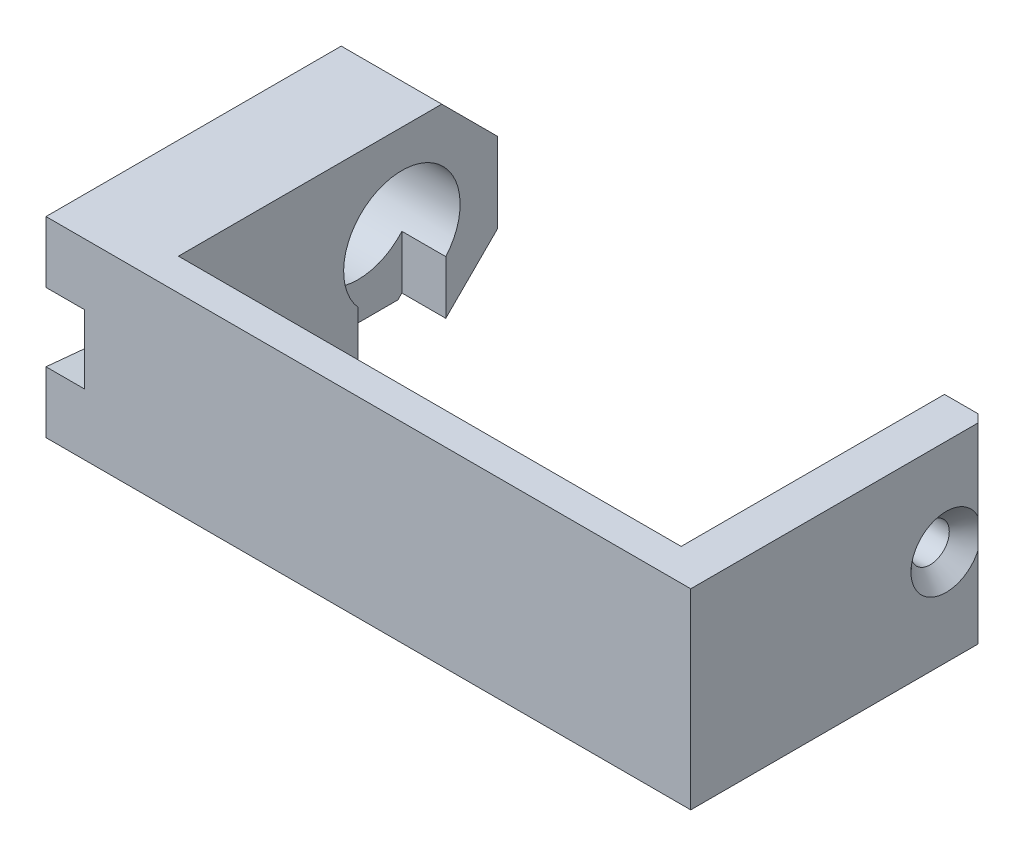
ISO-10303-21;
HEADER;
FILE_DESCRIPTION(('STEP AP214'),'2;1');
FILE_NAME('part.step','',(''),(''),'','','');
FILE_SCHEMA(('AUTOMOTIVE_DESIGN { 1 0 10303 214 1 1 1 1 }'));
ENDSEC;
DATA;
#1=APPLICATION_CONTEXT('core data for automotive mechanical design processes');
#2=APPLICATION_PROTOCOL_DEFINITION('international standard','automotive_design',2000,#1);
#3=PRODUCT_CONTEXT('',#1,'mechanical');
#4=PRODUCT('Part','Part','',(#3));
#5=PRODUCT_RELATED_PRODUCT_CATEGORY('part','',(#4));
#6=PRODUCT_DEFINITION_FORMATION('','',#4);
#7=PRODUCT_DEFINITION_CONTEXT('part definition',#1,'design');
#8=PRODUCT_DEFINITION('design','',#6,#7);
#9=PRODUCT_DEFINITION_SHAPE('','',#8);
#10=(LENGTH_UNIT() NAMED_UNIT(*) SI_UNIT(.MILLI.,.METRE.));
#11=(NAMED_UNIT(*) PLANE_ANGLE_UNIT() SI_UNIT($,.RADIAN.));
#12=(NAMED_UNIT(*) SI_UNIT($,.STERADIAN.) SOLID_ANGLE_UNIT());
#13=UNCERTAINTY_MEASURE_WITH_UNIT(LENGTH_MEASURE(1.E-05),#10,'distance_accuracy_value','');
#14=(GEOMETRIC_REPRESENTATION_CONTEXT(3) GLOBAL_UNCERTAINTY_ASSIGNED_CONTEXT((#13)) GLOBAL_UNIT_ASSIGNED_CONTEXT((#10,
#11,#12)) REPRESENTATION_CONTEXT('',''));
#15=CARTESIAN_POINT('',(0.,0.,0.));
#16=DIRECTION('',(0.,0.,1.));
#17=DIRECTION('',(1.,0.,0.));
#18=AXIS2_PLACEMENT_3D('',#15,#16,#17);
#19=CARTESIAN_POINT('',(20.2,-6.,22.));
#20=DIRECTION('',(0.,-1.,0.));
#21=DIRECTION('',(1.,0.,0.));
#22=AXIS2_PLACEMENT_3D('',#19,#20,#21);
#23=PLANE('',#22);
#24=DIRECTION('',(0.,0.,1.));
#25=VECTOR('',#24,1.);
#26=CARTESIAN_POINT('',(-16.65,-6.,22.));
#27=LINE('',#26,#25);
#28=CARTESIAN_POINT('',(-16.65,-6.,3.50000000000002));
#29=VERTEX_POINT('',#28);
#30=CARTESIAN_POINT('',(-16.65,-6.,8.75));
#31=VERTEX_POINT('',#30);
#32=EDGE_CURVE('E187',#29,#31,#27,.T.);
#33=ORIENTED_EDGE('',*,*,#32,.T.);
#34=DIRECTION('',(1.,0.,0.));
#35=VECTOR('',#34,1.);
#36=CARTESIAN_POINT('',(20.2,-6.,8.75));
#37=LINE('',#36,#35);
#38=CARTESIAN_POINT('',(-13.9,-6.,8.75));
#39=VERTEX_POINT('',#38);
#40=EDGE_CURVE('E209',#31,#39,#37,.T.);
#41=ORIENTED_EDGE('',*,*,#40,.T.);
#42=DIRECTION('',(0.,0.,1.));
#43=VECTOR('',#42,1.);
#44=CARTESIAN_POINT('',(-13.9,-6.,0.));
#45=LINE('',#44,#43);
#46=CARTESIAN_POINT('',(-13.9,-6.,20.));
#47=VERTEX_POINT('',#46);
#48=EDGE_CURVE('E246',#39,#47,#45,.T.);
#49=ORIENTED_EDGE('',*,*,#48,.T.);
#50=DIRECTION('',(1.,0.,0.));
#51=VECTOR('',#50,1.);
#52=CARTESIAN_POINT('',(-13.9,-6.,20.));
#53=LINE('',#52,#51);
#54=CARTESIAN_POINT('',(17.6,-6.,20.));
#55=VERTEX_POINT('',#54);
#56=EDGE_CURVE('E260',#47,#55,#53,.T.);
#57=ORIENTED_EDGE('',*,*,#56,.T.);
#58=DIRECTION('',(0.,0.,-1.));
#59=VECTOR('',#58,1.);
#60=CARTESIAN_POINT('',(17.6,-6.,0.));
#61=LINE('',#60,#59);
#62=CARTESIAN_POINT('',(17.6,-6.,3.50000000000002));
#63=VERTEX_POINT('',#62);
#64=EDGE_CURVE('E243',#55,#63,#61,.T.);
#65=ORIENTED_EDGE('',*,*,#64,.T.);
#66=DIRECTION('',(1.,0.,0.));
#67=VECTOR('',#66,1.);
#68=CARTESIAN_POINT('',(20.2,-6.,3.50000000000002));
#69=LINE('',#68,#67);
#70=CARTESIAN_POINT('',(19.6999999999999,-6.,3.50000000000002));
#71=VERTEX_POINT('',#70);
#72=EDGE_CURVE('E302',#63,#71,#69,.T.);
#73=ORIENTED_EDGE('',*,*,#72,.T.);
#74=DIRECTION('',(-0.707106781186544,0.,-0.707106781186551));
#75=VECTOR('',#74,1.);
#76=CARTESIAN_POINT('',(29.2,-6.,13.0000000000001));
#77=LINE('',#76,#75);
#78=CARTESIAN_POINT('',(20.2,-6.,4.00000000000007));
#79=VERTEX_POINT('',#78);
#80=EDGE_CURVE('E431',#71,#79,#77,.F.);
#81=ORIENTED_EDGE('',*,*,#80,.T.);
#82=DIRECTION('',(0.,0.,-1.));
#83=VECTOR('',#82,1.);
#84=CARTESIAN_POINT('',(20.2,-6.,22.));
#85=LINE('',#84,#83);
#86=CARTESIAN_POINT('',(20.2,-6.,22.));
#87=VERTEX_POINT('',#86);
#88=EDGE_CURVE('E281',#87,#79,#85,.T.);
#89=ORIENTED_EDGE('',*,*,#88,.F.);
#90=DIRECTION('',(-1.,0.,0.));
#91=VECTOR('',#90,1.);
#92=CARTESIAN_POINT('',(20.2,-6.,22.));
#93=LINE('',#92,#91);
#94=CARTESIAN_POINT('',(-20.2,-6.,22.));
#95=VERTEX_POINT('',#94);
#96=EDGE_CURVE('E278',#87,#95,#93,.T.);
#97=ORIENTED_EDGE('',*,*,#96,.T.);
#98=DIRECTION('',(0.,0.,-1.));
#99=VECTOR('',#98,1.);
#100=CARTESIAN_POINT('',(-20.2,-6.,22.));
#101=LINE('',#100,#99);
#102=CARTESIAN_POINT('',(-20.2,-6.,3.50000000000002));
#103=VERTEX_POINT('',#102);
#104=EDGE_CURVE('E286',#95,#103,#101,.T.);
#105=ORIENTED_EDGE('',*,*,#104,.T.);
#106=DIRECTION('',(1.,0.,0.));
#107=VECTOR('',#106,1.);
#108=CARTESIAN_POINT('',(-13.9,-6.,3.50000000000002));
#109=LINE('',#108,#107);
#110=EDGE_CURVE('E300',#103,#29,#109,.T.);
#111=ORIENTED_EDGE('',*,*,#110,.T.);
#112=EDGE_LOOP('',(#33,#41,#49,#57,#65,#73,#81,#89,#97,#105,#111));
#113=FACE_BOUND('',#112,.T.);
#114=ADVANCED_FACE('F37',(#113),#23,.T.);
#115=CARTESIAN_POINT('',(-13.9,-6.00100000000001,0.));
#116=DIRECTION('',(-1.,0.,0.));
#117=DIRECTION('',(0.,0.,1.));
#118=AXIS2_PLACEMENT_3D('',#115,#116,#117);
#119=PLANE('',#118);
#120=DIRECTION('',(0.,-1.,0.));
#121=VECTOR('',#120,1.);
#122=CARTESIAN_POINT('',(-13.9,-6.00100000000001,8.75));
#123=LINE('',#122,#121);
#124=CARTESIAN_POINT('',(-13.9,-2.4,8.75));
#125=VERTEX_POINT('',#124);
#126=EDGE_CURVE('E207',#125,#39,#123,.T.);
#127=ORIENTED_EDGE('',*,*,#126,.F.);
#128=CARTESIAN_POINT('',(-13.9,0.,6.));
#129=DIRECTION('',(-1.,0.,0.));
#130=DIRECTION('',(0.,0.,1.));
#131=AXIS2_PLACEMENT_3D('',#128,#129,#130);
#132=CIRCLE('',#131,3.65);
#133=CARTESIAN_POINT('',(-13.9,-2.4,3.25));
#134=VERTEX_POINT('',#133);
#135=EDGE_CURVE('E212',#125,#134,#132,.T.);
#136=ORIENTED_EDGE('',*,*,#135,.T.);
#137=DIRECTION('',(0.,1.,0.));
#138=VECTOR('',#137,1.);
#139=CARTESIAN_POINT('',(-13.9,-6.00100000000001,3.25));
#140=LINE('',#139,#138);
#141=CARTESIAN_POINT('',(-13.9,-5.74999999999999,3.25));
#142=VERTEX_POINT('',#141);
#143=EDGE_CURVE('E53',#142,#134,#140,.T.);
#144=ORIENTED_EDGE('',*,*,#143,.F.);
#145=DIRECTION('',(0.,0.707106781186546,-0.707106781186549));
#146=VECTOR('',#145,1.);
#147=CARTESIAN_POINT('',(-13.9,-2.5,0.));
#148=LINE('',#147,#146);
#149=CARTESIAN_POINT('',(-13.9,-2.5,0.));
#150=VERTEX_POINT('',#149);
#151=EDGE_CURVE('E201',#142,#150,#148,.T.);
#152=ORIENTED_EDGE('',*,*,#151,.T.);
#153=DIRECTION('',(0.,1.,0.));
#154=VECTOR('',#153,1.);
#155=CARTESIAN_POINT('',(-13.9,-6.00100000000001,0.));
#156=LINE('',#155,#154);
#157=CARTESIAN_POINT('',(-13.9,2.49999999999999,0.));
#158=VERTEX_POINT('',#157);
#159=EDGE_CURVE('E257',#150,#158,#156,.T.);
#160=ORIENTED_EDGE('',*,*,#159,.T.);
#161=DIRECTION('',(0.,-0.707106781186548,-0.707106781186547));
#162=VECTOR('',#161,1.);
#163=CARTESIAN_POINT('',(-13.9,6.,3.50000000000001));
#164=LINE('',#163,#162);
#165=CARTESIAN_POINT('',(-13.9,6.,3.5));
#166=VERTEX_POINT('',#165);
#167=EDGE_CURVE('E319',#158,#166,#164,.F.);
#168=ORIENTED_EDGE('',*,*,#167,.T.);
#169=DIRECTION('',(0.,0.,1.));
#170=VECTOR('',#169,1.);
#171=CARTESIAN_POINT('',(-13.9,6.,0.));
#172=LINE('',#171,#170);
#173=CARTESIAN_POINT('',(-13.9,6.,20.));
#174=VERTEX_POINT('',#173);
#175=EDGE_CURVE('E248',#166,#174,#172,.T.);
#176=ORIENTED_EDGE('',*,*,#175,.T.);
#177=DIRECTION('',(0.,1.,0.));
#178=VECTOR('',#177,1.);
#179=CARTESIAN_POINT('',(-13.9,-6.00100000000001,20.));
#180=LINE('',#179,#178);
#181=EDGE_CURVE('E256',#47,#174,#180,.T.);
#182=ORIENTED_EDGE('',*,*,#181,.F.);
#183=ORIENTED_EDGE('',*,*,#48,.F.);
#184=EDGE_LOOP('',(#127,#136,#144,#152,#160,#168,#176,#182,#183));
#185=FACE_BOUND('',#184,.T.);
#186=ADVANCED_FACE('F361',(#185),#119,.F.);
#187=CARTESIAN_POINT('',(0.,-2.5,0.));
#188=DIRECTION('',(0.,-0.707106781186549,-0.707106781186546));
#189=DIRECTION('',(1.,0.,0.));
#190=AXIS2_PLACEMENT_3D('',#187,#188,#189);
#191=PLANE('',#190);
#192=DIRECTION('',(-1.,0.,0.));
#193=VECTOR('',#192,1.);
#194=CARTESIAN_POINT('',(0.,-5.74999999999999,3.25));
#195=LINE('',#194,#193);
#196=CARTESIAN_POINT('',(-16.65,-5.74999999999998,3.25));
#197=VERTEX_POINT('',#196);
#198=EDGE_CURVE('E192',#142,#197,#195,.T.);
#199=ORIENTED_EDGE('',*,*,#198,.T.);
#200=DIRECTION('',(0.,-0.707106781186546,0.707106781186549));
#201=VECTOR('',#200,1.);
#202=CARTESIAN_POINT('',(-16.65,-2.5,0.));
#203=LINE('',#202,#201);
#204=EDGE_CURVE('E180',#197,#29,#203,.T.);
#205=ORIENTED_EDGE('',*,*,#204,.T.);
#206=ORIENTED_EDGE('',*,*,#110,.F.);
#207=DIRECTION('',(0.,-0.707106781186546,0.707106781186549));
#208=VECTOR('',#207,1.);
#209=CARTESIAN_POINT('',(-20.2,-15.25,12.75));
#210=LINE('',#209,#208);
#211=CARTESIAN_POINT('',(-20.2,-2.5,0.));
#212=VERTEX_POINT('',#211);
#213=EDGE_CURVE('E317',#212,#103,#210,.T.);
#214=ORIENTED_EDGE('',*,*,#213,.F.);
#215=DIRECTION('',(-1.,0.,0.));
#216=VECTOR('',#215,1.);
#217=CARTESIAN_POINT('',(-20.2,-2.5,0.));
#218=LINE('',#217,#216);
#219=EDGE_CURVE('E312',#150,#212,#218,.T.);
#220=ORIENTED_EDGE('',*,*,#219,.F.);
#221=ORIENTED_EDGE('',*,*,#151,.F.);
#222=EDGE_LOOP('',(#199,#205,#206,#214,#220,#221));
#223=FACE_BOUND('',#222,.T.);
#224=ADVANCED_FACE('F199',(#223),#191,.T.);
#225=CARTESIAN_POINT('',(-17.8,0.,6.));
#226=DIRECTION('',(-1.,0.,0.));
#227=DIRECTION('',(0.,0.,1.));
#228=AXIS2_PLACEMENT_3D('',#225,#226,#227);
#229=CYLINDRICAL_SURFACE('',#228,3.65);
#230=CARTESIAN_POINT('',(-20.2,0.,6.));
#231=DIRECTION('',(-1.,0.,0.));
#232=DIRECTION('',(0.,0.,1.));
#233=AXIS2_PLACEMENT_3D('',#230,#231,#232);
#234=CIRCLE('',#233,3.65);
#235=CARTESIAN_POINT('',(-20.2,3.63376091186189,6.34392097264438));
#236=VERTEX_POINT('',#235);
#237=CARTESIAN_POINT('',(-20.2,-3.63376091186189,6.34392097264438));
#238=VERTEX_POINT('',#237);
#239=EDGE_CURVE('E215',#236,#238,#234,.T.);
#240=ORIENTED_EDGE('',*,*,#239,.T.);
#241=DIRECTION('',(-1.,0.,0.));
#242=VECTOR('',#241,1.);
#243=CARTESIAN_POINT('',(-17.8,-3.63376091186189,6.34392097264438));
#244=LINE('',#243,#242);
#245=CARTESIAN_POINT('',(-17.8,-3.63376091186189,6.34392097264438));
#246=VERTEX_POINT('',#245);
#247=EDGE_CURVE('E221',#246,#238,#244,.T.);
#248=ORIENTED_EDGE('',*,*,#247,.F.);
#249=CARTESIAN_POINT('',(-17.8,0.,6.));
#250=DIRECTION('',(-1.,0.,0.));
#251=DIRECTION('',(0.,0.,1.));
#252=AXIS2_PLACEMENT_3D('',#249,#250,#251);
#253=CIRCLE('',#252,3.65);
#254=CARTESIAN_POINT('',(-17.8,3.63376091186189,6.34392097264438));
#255=VERTEX_POINT('',#254);
#256=EDGE_CURVE('E417',#246,#255,#253,.T.);
#257=ORIENTED_EDGE('',*,*,#256,.T.);
#258=DIRECTION('',(-1.,0.,0.));
#259=VECTOR('',#258,1.);
#260=CARTESIAN_POINT('',(-17.8,3.63376091186189,6.34392097264438));
#261=LINE('',#260,#259);
#262=EDGE_CURVE('E227',#255,#236,#261,.T.);
#263=ORIENTED_EDGE('',*,*,#262,.T.);
#264=EDGE_LOOP('',(#240,#248,#257,#263));
#265=FACE_BOUND('',#264,.T.);
#266=DIRECTION('',(-1.,0.,0.));
#267=VECTOR('',#266,1.);
#268=CARTESIAN_POINT('',(-17.8,-2.4,8.75));
#269=LINE('',#268,#267);
#270=CARTESIAN_POINT('',(-16.65,-2.4,8.75));
#271=VERTEX_POINT('',#270);
#272=EDGE_CURVE('E11',#271,#125,#269,.F.);
#273=ORIENTED_EDGE('',*,*,#272,.F.);
#274=CARTESIAN_POINT('',(-16.65,0.,6.));
#275=DIRECTION('',(1.,0.,0.));
#276=DIRECTION('',(0.,1.,0.));
#277=AXIS2_PLACEMENT_3D('',#274,#275,#276);
#278=CIRCLE('',#277,3.65);
#279=CARTESIAN_POINT('',(-16.65,-2.4,3.25));
#280=VERTEX_POINT('',#279);
#281=EDGE_CURVE('E46',#280,#271,#278,.F.);
#282=ORIENTED_EDGE('',*,*,#281,.F.);
#283=DIRECTION('',(-1.,0.,0.));
#284=VECTOR('',#283,1.);
#285=CARTESIAN_POINT('',(-17.8,-2.4,3.25));
#286=LINE('',#285,#284);
#287=EDGE_CURVE('E195',#134,#280,#286,.T.);
#288=ORIENTED_EDGE('',*,*,#287,.F.);
#289=ORIENTED_EDGE('',*,*,#135,.F.);
#290=EDGE_LOOP('',(#273,#282,#288,#289));
#291=FACE_BOUND('',#290,.T.);
#292=ADVANCED_FACE('F353',(#265,#291),#229,.F.);
#293=CARTESIAN_POINT('',(17.6,-6.001,0.));
#294=DIRECTION('',(1.,0.,0.));
#295=DIRECTION('',(0.,0.,-1.));
#296=AXIS2_PLACEMENT_3D('',#293,#294,#295);
#297=PLANE('',#296);
#298=DIRECTION('',(0.,0.707106781186549,0.707106781186546));
#299=VECTOR('',#298,1.);
#300=CARTESIAN_POINT('',(17.6,6.,3.5));
#301=LINE('',#300,#299);
#302=CARTESIAN_POINT('',(17.6,6.,3.5));
#303=VERTEX_POINT('',#302);
#304=CARTESIAN_POINT('',(17.6,3.90000000000003,1.40000000000004));
#305=VERTEX_POINT('',#304);
#306=EDGE_CURVE('E295',#303,#305,#301,.F.);
#307=ORIENTED_EDGE('',*,*,#306,.T.);
#308=DIRECTION('',(0.,1.,0.));
#309=VECTOR('',#308,1.);
#310=CARTESIAN_POINT('',(17.6,-6.,1.40000000000004));
#311=LINE('',#310,#309);
#312=CARTESIAN_POINT('',(17.6,-3.90000000000003,1.40000000000004));
#313=VERTEX_POINT('',#312);
#314=EDGE_CURVE('E435',#305,#313,#311,.F.);
#315=ORIENTED_EDGE('',*,*,#314,.T.);
#316=DIRECTION('',(0.,-0.707106781186546,0.707106781186549));
#317=VECTOR('',#316,1.);
#318=CARTESIAN_POINT('',(17.6,-2.49999999999999,0.));
#319=LINE('',#318,#317);
#320=EDGE_CURVE('E298',#313,#63,#319,.T.);
#321=ORIENTED_EDGE('',*,*,#320,.T.);
#322=ORIENTED_EDGE('',*,*,#64,.F.);
#323=DIRECTION('',(0.,1.,0.));
#324=VECTOR('',#323,1.);
#325=CARTESIAN_POINT('',(17.6,-6.001,20.));
#326=LINE('',#325,#324);
#327=CARTESIAN_POINT('',(17.6,6.,20.));
#328=VERTEX_POINT('',#327);
#329=EDGE_CURVE('E261',#55,#328,#326,.T.);
#330=ORIENTED_EDGE('',*,*,#329,.T.);
#331=DIRECTION('',(0.,0.,-1.));
#332=VECTOR('',#331,1.);
#333=CARTESIAN_POINT('',(17.6,6.,0.));
#334=LINE('',#333,#332);
#335=EDGE_CURVE('E253',#328,#303,#334,.T.);
#336=ORIENTED_EDGE('',*,*,#335,.T.);
#337=EDGE_LOOP('',(#307,#315,#321,#322,#330,#336));
#338=FACE_BOUND('',#337,.T.);
#339=CARTESIAN_POINT('',(17.6,0.,6.));
#340=DIRECTION('',(1.,0.,0.));
#341=DIRECTION('',(0.,0.,-1.));
#342=AXIS2_PLACEMENT_3D('',#339,#340,#341);
#343=CIRCLE('',#342,2.5);
#344=CARTESIAN_POINT('',(17.6,0.,3.5));
#345=VERTEX_POINT('',#344);
#346=EDGE_CURVE('E428',#345,#345,#343,.F.);
#347=ORIENTED_EDGE('',*,*,#346,.F.);
#348=EDGE_LOOP('',(#347));
#349=FACE_BOUND('',#348,.T.);
#350=ADVANCED_FACE('F349',(#338,#349),#297,.F.);
#351=CARTESIAN_POINT('',(0.,0.,0.));
#352=DIRECTION('',(0.,0.,1.));
#353=DIRECTION('',(1.,0.,0.));
#354=AXIS2_PLACEMENT_3D('',#351,#352,#353);
#355=PLANE('',#354);
#356=ORIENTED_EDGE('',*,*,#159,.F.);
#357=ORIENTED_EDGE('',*,*,#219,.T.);
#358=DIRECTION('',(0.,1.,0.));
#359=VECTOR('',#358,1.);
#360=CARTESIAN_POINT('',(-20.2,-6.,0.));
#361=LINE('',#360,#359);
#362=CARTESIAN_POINT('',(-20.2,2.49999999999999,0.));
#363=VERTEX_POINT('',#362);
#364=EDGE_CURVE('E267',#212,#363,#361,.T.);
#365=ORIENTED_EDGE('',*,*,#364,.T.);
#366=DIRECTION('',(1.,0.,0.));
#367=VECTOR('',#366,1.);
#368=CARTESIAN_POINT('',(0.,2.49999999999999,0.));
#369=LINE('',#368,#367);
#370=EDGE_CURVE('E310',#363,#158,#369,.T.);
#371=ORIENTED_EDGE('',*,*,#370,.T.);
#372=EDGE_LOOP('',(#356,#357,#365,#371));
#373=FACE_BOUND('',#372,.T.);
#374=ADVANCED_FACE('F352',(#373),#355,.F.);
#375=CARTESIAN_POINT('',(20.2,-6.,22.));
#376=DIRECTION('',(-1.,0.,0.));
#377=DIRECTION('',(0.,0.,1.));
#378=AXIS2_PLACEMENT_3D('',#375,#376,#377);
#379=PLANE('',#378);
#380=ORIENTED_EDGE('',*,*,#88,.T.);
#381=DIRECTION('',(0.,1.,0.));
#382=VECTOR('',#381,1.);
#383=CARTESIAN_POINT('',(20.2,-6.,4.00000000000007));
#384=LINE('',#383,#382);
#385=CARTESIAN_POINT('',(20.2,-0.916515138991321,4.00000000000007));
#386=VERTEX_POINT('',#385);
#387=EDGE_CURVE('E324',#79,#386,#384,.T.);
#388=ORIENTED_EDGE('',*,*,#387,.T.);
#389=CARTESIAN_POINT('',(20.2,0.,6.));
#390=DIRECTION('',(1.,0.,0.));
#391=DIRECTION('',(0.,0.,-1.));
#392=AXIS2_PLACEMENT_3D('',#389,#390,#391);
#393=CIRCLE('',#392,2.2);
#394=CARTESIAN_POINT('',(20.2,0.916515138991321,4.00000000000007));
#395=VERTEX_POINT('',#394);
#396=EDGE_CURVE('E237',#395,#386,#393,.T.);
#397=ORIENTED_EDGE('',*,*,#396,.F.);
#398=DIRECTION('',(0.,1.,0.));
#399=VECTOR('',#398,1.);
#400=CARTESIAN_POINT('',(20.2,-6.,4.00000000000007));
#401=LINE('',#400,#399);
#402=CARTESIAN_POINT('',(20.2,6.,4.00000000000007));
#403=VERTEX_POINT('',#402);
#404=EDGE_CURVE('E322',#395,#403,#401,.T.);
#405=ORIENTED_EDGE('',*,*,#404,.T.);
#406=DIRECTION('',(0.,0.,-1.));
#407=VECTOR('',#406,1.);
#408=CARTESIAN_POINT('',(20.2,6.,22.));
#409=LINE('',#408,#407);
#410=CARTESIAN_POINT('',(20.2,6.,22.));
#411=VERTEX_POINT('',#410);
#412=EDGE_CURVE('E292',#411,#403,#409,.T.);
#413=ORIENTED_EDGE('',*,*,#412,.F.);
#414=DIRECTION('',(0.,1.,0.));
#415=VECTOR('',#414,1.);
#416=CARTESIAN_POINT('',(20.2,-6.,22.));
#417=LINE('',#416,#415);
#418=EDGE_CURVE('E268',#87,#411,#417,.T.);
#419=ORIENTED_EDGE('',*,*,#418,.F.);
#420=EDGE_LOOP('',(#380,#388,#397,#405,#413,#419));
#421=FACE_BOUND('',#420,.T.);
#422=ADVANCED_FACE('F371',(#421),#379,.F.);
#423=CARTESIAN_POINT('',(20.2,6.,22.));
#424=DIRECTION('',(0.,-1.,0.));
#425=DIRECTION('',(1.,0.,0.));
#426=AXIS2_PLACEMENT_3D('',#423,#424,#425);
#427=PLANE('',#426);
#428=ORIENTED_EDGE('',*,*,#412,.T.);
#429=DIRECTION('',(0.707106781186544,0.,0.707106781186551));
#430=VECTOR('',#429,1.);
#431=CARTESIAN_POINT('',(20.2,6.,4.00000000000007));
#432=LINE('',#431,#430);
#433=CARTESIAN_POINT('',(19.6999999999999,6.,3.5));
#434=VERTEX_POINT('',#433);
#435=EDGE_CURVE('E334',#403,#434,#432,.F.);
#436=ORIENTED_EDGE('',*,*,#435,.T.);
#437=DIRECTION('',(-1.,0.,0.));
#438=VECTOR('',#437,1.);
#439=CARTESIAN_POINT('',(20.2,6.,3.5));
#440=LINE('',#439,#438);
#441=EDGE_CURVE('E308',#434,#303,#440,.T.);
#442=ORIENTED_EDGE('',*,*,#441,.T.);
#443=ORIENTED_EDGE('',*,*,#335,.F.);
#444=DIRECTION('',(1.,0.,0.));
#445=VECTOR('',#444,1.);
#446=CARTESIAN_POINT('',(-13.9,6.,20.));
#447=LINE('',#446,#445);
#448=EDGE_CURVE('E250',#174,#328,#447,.T.);
#449=ORIENTED_EDGE('',*,*,#448,.F.);
#450=ORIENTED_EDGE('',*,*,#175,.F.);
#451=DIRECTION('',(-1.,0.,0.));
#452=VECTOR('',#451,1.);
#453=CARTESIAN_POINT('',(20.2,6.,3.5));
#454=LINE('',#453,#452);
#455=CARTESIAN_POINT('',(-20.2,6.,3.5));
#456=VERTEX_POINT('',#455);
#457=EDGE_CURVE('E305',#166,#456,#454,.T.);
#458=ORIENTED_EDGE('',*,*,#457,.T.);
#459=DIRECTION('',(0.,0.,-1.));
#460=VECTOR('',#459,1.);
#461=CARTESIAN_POINT('',(-20.2,6.,22.));
#462=LINE('',#461,#460);
#463=CARTESIAN_POINT('',(-20.2,6.,22.));
#464=VERTEX_POINT('',#463);
#465=EDGE_CURVE('E289',#464,#456,#462,.T.);
#466=ORIENTED_EDGE('',*,*,#465,.F.);
#467=DIRECTION('',(-1.,0.,0.));
#468=VECTOR('',#467,1.);
#469=CARTESIAN_POINT('',(20.2,6.,22.));
#470=LINE('',#469,#468);
#471=EDGE_CURVE('E271',#411,#464,#470,.T.);
#472=ORIENTED_EDGE('',*,*,#471,.F.);
#473=EDGE_LOOP('',(#428,#436,#442,#443,#449,#450,#458,#466,#472));
#474=FACE_BOUND('',#473,.T.);
#475=ADVANCED_FACE('F378',(#474),#427,.F.);
#476=CARTESIAN_POINT('',(-20.2,-6.,22.));
#477=DIRECTION('',(-1.,0.,0.));
#478=DIRECTION('',(0.,0.,1.));
#479=AXIS2_PLACEMENT_3D('',#476,#477,#478);
#480=PLANE('',#479);
#481=DIRECTION('',(0.,0.0942249240121581,-0.995550934756682));
#482=VECTOR('',#481,1.);
#483=CARTESIAN_POINT('',(-20.2,3.63376091186189,6.34392097264438));
#484=LINE('',#483,#482);
#485=CARTESIAN_POINT('',(-20.2,2.15197549518557,22.));
#486=VERTEX_POINT('',#485);
#487=EDGE_CURVE('E218',#486,#236,#484,.T.);
#488=ORIENTED_EDGE('',*,*,#487,.F.);
#489=DIRECTION('',(0.,1.,0.));
#490=VECTOR('',#489,1.);
#491=CARTESIAN_POINT('',(-20.2,-6.,22.));
#492=LINE('',#491,#490);
#493=EDGE_CURVE('E274',#486,#464,#492,.T.);
#494=ORIENTED_EDGE('',*,*,#493,.T.);
#495=ORIENTED_EDGE('',*,*,#465,.T.);
#496=DIRECTION('',(0.,0.707106781186548,0.707106781186547));
#497=VECTOR('',#496,1.);
#498=CARTESIAN_POINT('',(-20.2,9.24999999999998,6.74999999999998));
#499=LINE('',#498,#497);
#500=EDGE_CURVE('E315',#456,#363,#499,.F.);
#501=ORIENTED_EDGE('',*,*,#500,.T.);
#502=ORIENTED_EDGE('',*,*,#364,.F.);
#503=ORIENTED_EDGE('',*,*,#213,.T.);
#504=ORIENTED_EDGE('',*,*,#104,.F.);
#505=CARTESIAN_POINT('',(-20.2,-2.15197549518557,22.));
#506=VERTEX_POINT('',#505);
#507=EDGE_CURVE('E275',#95,#506,#492,.T.);
#508=ORIENTED_EDGE('',*,*,#507,.T.);
#509=DIRECTION('',(0.,0.0942249240121581,0.995550934756682));
#510=VECTOR('',#509,1.);
#511=CARTESIAN_POINT('',(-20.2,-3.63376091186189,6.34392097264438));
#512=LINE('',#511,#510);
#513=EDGE_CURVE('E224',#238,#506,#512,.T.);
#514=ORIENTED_EDGE('',*,*,#513,.F.);
#515=ORIENTED_EDGE('',*,*,#239,.F.);
#516=EDGE_LOOP('',(#488,#494,#495,#501,#502,#503,#504,#508,#514,#515));
#517=FACE_BOUND('',#516,.T.);
#518=ADVANCED_FACE('F367',(#517),#480,.T.);
#519=CARTESIAN_POINT('',(0.,0.,22.));
#520=DIRECTION('',(0.,0.,1.));
#521=DIRECTION('',(1.,0.,0.));
#522=AXIS2_PLACEMENT_3D('',#519,#520,#521);
#523=PLANE('',#522);
#524=DIRECTION('',(-1.,0.,0.));
#525=VECTOR('',#524,1.);
#526=CARTESIAN_POINT('',(0.,2.15197549518557,22.));
#527=LINE('',#526,#525);
#528=CARTESIAN_POINT('',(-17.8,2.15197549518557,22.));
#529=VERTEX_POINT('',#528);
#530=EDGE_CURVE('E421',#529,#486,#527,.T.);
#531=ORIENTED_EDGE('',*,*,#530,.F.);
#532=DIRECTION('',(0.,-1.,0.));
#533=VECTOR('',#532,1.);
#534=CARTESIAN_POINT('',(-17.8,0.,22.));
#535=LINE('',#534,#533);
#536=CARTESIAN_POINT('',(-17.8,-2.15197549518557,22.));
#537=VERTEX_POINT('',#536);
#538=EDGE_CURVE('E425',#529,#537,#535,.T.);
#539=ORIENTED_EDGE('',*,*,#538,.T.);
#540=DIRECTION('',(1.,0.,0.));
#541=VECTOR('',#540,1.);
#542=CARTESIAN_POINT('',(0.,-2.15197549518557,22.));
#543=LINE('',#542,#541);
#544=EDGE_CURVE('E423',#506,#537,#543,.T.);
#545=ORIENTED_EDGE('',*,*,#544,.F.);
#546=ORIENTED_EDGE('',*,*,#507,.F.);
#547=ORIENTED_EDGE('',*,*,#96,.F.);
#548=ORIENTED_EDGE('',*,*,#418,.T.);
#549=ORIENTED_EDGE('',*,*,#471,.T.);
#550=ORIENTED_EDGE('',*,*,#493,.F.);
#551=EDGE_LOOP('',(#531,#539,#545,#546,#547,#548,#549,#550));
#552=FACE_BOUND('',#551,.T.);
#553=ADVANCED_FACE('F359',(#552),#523,.T.);
#554=CARTESIAN_POINT('',(-13.9,-6.00100000000001,20.));
#555=DIRECTION('',(0.,0.,1.));
#556=DIRECTION('',(1.,0.,0.));
#557=AXIS2_PLACEMENT_3D('',#554,#555,#556);
#558=PLANE('',#557);
#559=ORIENTED_EDGE('',*,*,#181,.T.);
#560=ORIENTED_EDGE('',*,*,#448,.T.);
#561=ORIENTED_EDGE('',*,*,#329,.F.);
#562=ORIENTED_EDGE('',*,*,#56,.F.);
#563=EDGE_LOOP('',(#559,#560,#561,#562));
#564=FACE_BOUND('',#563,.T.);
#565=ADVANCED_FACE('F355',(#564),#558,.F.);
#566=CARTESIAN_POINT('',(0.,-2.5,0.));
#567=DIRECTION('',(0.,-0.707106781186549,-0.707106781186546));
#568=DIRECTION('',(1.,0.,0.));
#569=AXIS2_PLACEMENT_3D('',#566,#567,#568);
#570=PLANE('',#569);
#571=ORIENTED_EDGE('',*,*,#320,.F.);
#572=DIRECTION('',(-0.577350269189623,0.577350269189626,-0.577350269189629));
#573=VECTOR('',#572,1.);
#574=CARTESIAN_POINT('',(10.8,2.89999999999997,-5.39999999999999));
#575=LINE('',#574,#573);
#576=EDGE_CURVE('E433',#313,#71,#575,.F.);
#577=ORIENTED_EDGE('',*,*,#576,.T.);
#578=ORIENTED_EDGE('',*,*,#72,.F.);
#579=EDGE_LOOP('',(#571,#577,#578));
#580=FACE_BOUND('',#579,.T.);
#581=ADVANCED_FACE('F358',(#580),#570,.T.);
#582=CARTESIAN_POINT('',(20.2,6.,3.5));
#583=DIRECTION('',(0.,-0.707106781186546,0.707106781186549));
#584=DIRECTION('',(-1.,0.,0.));
#585=AXIS2_PLACEMENT_3D('',#582,#583,#584);
#586=PLANE('',#585);
#587=ORIENTED_EDGE('',*,*,#441,.F.);
#588=DIRECTION('',(-0.577350269189621,-0.577350269189629,-0.577350269189627));
#589=VECTOR('',#588,1.);
#590=CARTESIAN_POINT('',(19.8666666666666,6.16666666666669,3.66666666666669));
#591=LINE('',#590,#589);
#592=EDGE_CURVE('E436',#434,#305,#591,.T.);
#593=ORIENTED_EDGE('',*,*,#592,.T.);
#594=ORIENTED_EDGE('',*,*,#306,.F.);
#595=EDGE_LOOP('',(#587,#593,#594));
#596=FACE_BOUND('',#595,.T.);
#597=ADVANCED_FACE('F388',(#596),#586,.F.);
#598=CARTESIAN_POINT('',(20.2,6.,3.5));
#599=DIRECTION('',(0.,-0.707106781186547,0.707106781186548));
#600=DIRECTION('',(-1.,0.,0.));
#601=AXIS2_PLACEMENT_3D('',#598,#599,#600);
#602=PLANE('',#601);
#603=ORIENTED_EDGE('',*,*,#167,.F.);
#604=ORIENTED_EDGE('',*,*,#370,.F.);
#605=ORIENTED_EDGE('',*,*,#500,.F.);
#606=ORIENTED_EDGE('',*,*,#457,.F.);
#607=EDGE_LOOP('',(#603,#604,#605,#606));
#608=FACE_BOUND('',#607,.T.);
#609=ADVANCED_FACE('F347',(#608),#602,.F.);
#610=CARTESIAN_POINT('',(20.2,0.,6.));
#611=DIRECTION('',(1.,0.,0.));
#612=DIRECTION('',(0.,0.,-1.));
#613=AXIS2_PLACEMENT_3D('',#610,#611,#612);
#614=CYLINDRICAL_SURFACE('',#613,1.2);
#615=CARTESIAN_POINT('',(19.2,0.,6.));
#616=DIRECTION('',(1.,0.,0.));
#617=DIRECTION('',(0.,0.,-1.));
#618=AXIS2_PLACEMENT_3D('',#615,#616,#617);
#619=CIRCLE('',#618,1.2);
#620=CARTESIAN_POINT('',(19.2,0.,4.8));
#621=VERTEX_POINT('',#620);
#622=EDGE_CURVE('E240',#621,#621,#619,.T.);
#623=ORIENTED_EDGE('',*,*,#622,.T.);
#624=EDGE_LOOP('',(#623));
#625=FACE_BOUND('',#624,.T.);
#626=CARTESIAN_POINT('',(17.1,0.,6.));
#627=DIRECTION('',(-1.,0.,0.));
#628=DIRECTION('',(0.,0.,1.));
#629=AXIS2_PLACEMENT_3D('',#626,#627,#628);
#630=CIRCLE('',#629,1.2);
#631=CARTESIAN_POINT('',(17.1,0.,7.2));
#632=VERTEX_POINT('',#631);
#633=EDGE_CURVE('E230',#632,#632,#630,.T.);
#634=ORIENTED_EDGE('',*,*,#633,.T.);
#635=EDGE_LOOP('',(#634));
#636=FACE_BOUND('',#635,.T.);
#637=ADVANCED_FACE('F341',(#625,#636),#614,.F.);
#638=CARTESIAN_POINT('',(20.2,0.,6.));
#639=DIRECTION('',(1.,0.,0.));
#640=DIRECTION('',(0.,0.,-1.));
#641=AXIS2_PLACEMENT_3D('',#638,#639,#640);
#642=CONICAL_SURFACE('',#641,2.2,0.785398163397447);
#643=ORIENTED_EDGE('',*,*,#622,.F.);
#644=EDGE_LOOP('',(#643));
#645=FACE_BOUND('',#644,.T.);
#646=ORIENTED_EDGE('',*,*,#396,.T.);
#647=CARTESIAN_POINT('',(20.2,-0.916515138991321,4.00000000000007));
#648=CARTESIAN_POINT('',(20.1811600411114,-0.830291408769074,3.9811600411115));
#649=CARTESIAN_POINT('',(20.1647807540092,-0.742955946316221,3.96478075400922));
#650=CARTESIAN_POINT('',(20.1372959140049,-0.566581357668592,3.93729591400494));
#651=CARTESIAN_POINT('',(20.1261941012815,-0.477541069605529,3.92619410128158));
#652=CARTESIAN_POINT('',(20.1098605117857,-0.300740735338158,3.90986051178575));
#653=CARTESIAN_POINT('',(20.1044829339975,-0.213008029177029,3.90448293399757));
#654=CARTESIAN_POINT('',(20.0992457322064,-0.0372749807929965,3.89924573220649));
#655=CARTESIAN_POINT('',(20.0993832033292,0.0507251961238984,3.89938320332927));
#656=CARTESIAN_POINT('',(20.1066007587501,0.269150557101952,3.90660075875012));
#657=CARTESIAN_POINT('',(20.1170252097773,0.399391725495782,3.91702520977736));
#658=CARTESIAN_POINT('',(20.141451420884,0.593745612789511,3.94145142088407));
#659=CARTESIAN_POINT('',(20.1512011193488,0.659006996637029,3.95120111934884));
#660=CARTESIAN_POINT('',(20.1735245603061,0.788539693883628,3.97352456030613));
#661=CARTESIAN_POINT('',(20.1860975324514,0.852811272254861,3.98609753245147));
#662=CARTESIAN_POINT('',(20.2,0.916515138991321,4.00000000000007));
#663=B_SPLINE_CURVE_WITH_KNOTS('',3,(#647,#648,#649,#650,#651,#652,#653,#654,#655,#656,#657,
#658,#659,#660,#661,#662),.UNSPECIFIED.,.F.,.F.,(4,2,2,2,2,2,2,4),(0.,0.270718365113195,
0.541628305018136,0.805459519907497,1.06915177202971,1.46110406264039,1.66110575950309,
1.86105295087017),.UNSPECIFIED.);
#664=EDGE_CURVE('E327',#386,#395,#663,.T.);
#665=ORIENTED_EDGE('',*,*,#664,.T.);
#666=EDGE_LOOP('',(#646,#665));
#667=FACE_BOUND('',#666,.T.);
#668=ADVANCED_FACE('F336',(#645,#667),#642,.F.);
#669=CARTESIAN_POINT('',(20.2,-6.,4.00000000000007));
#670=DIRECTION('',(-0.707106781186551,0.,0.707106781186544));
#671=DIRECTION('',(0.,1.,0.));
#672=AXIS2_PLACEMENT_3D('',#669,#670,#671);
#673=PLANE('',#672);
#674=ORIENTED_EDGE('',*,*,#576,.F.);
#675=ORIENTED_EDGE('',*,*,#314,.F.);
#676=ORIENTED_EDGE('',*,*,#592,.F.);
#677=ORIENTED_EDGE('',*,*,#435,.F.);
#678=ORIENTED_EDGE('',*,*,#404,.F.);
#679=ORIENTED_EDGE('',*,*,#664,.F.);
#680=ORIENTED_EDGE('',*,*,#387,.F.);
#681=ORIENTED_EDGE('',*,*,#80,.F.);
#682=EDGE_LOOP('',(#674,#675,#676,#677,#678,#679,#680,#681));
#683=FACE_BOUND('',#682,.T.);
#684=ADVANCED_FACE('F39',(#683),#673,.F.);
#685=CARTESIAN_POINT('',(17.1,0.,6.));
#686=DIRECTION('',(-1.,0.,0.));
#687=DIRECTION('',(0.,0.,1.));
#688=AXIS2_PLACEMENT_3D('',#685,#686,#687);
#689=PLANE('',#688);
#690=CARTESIAN_POINT('',(17.1,0.,6.));
#691=DIRECTION('',(-1.,0.,0.));
#692=DIRECTION('',(0.,0.,1.));
#693=AXIS2_PLACEMENT_3D('',#690,#691,#692);
#694=CIRCLE('',#693,2.5);
#695=CARTESIAN_POINT('',(17.1,0.,8.5));
#696=VERTEX_POINT('',#695);
#697=EDGE_CURVE('E234',#696,#696,#694,.T.);
#698=ORIENTED_EDGE('',*,*,#697,.T.);
#699=EDGE_LOOP('',(#698));
#700=FACE_BOUND('',#699,.T.);
#701=ORIENTED_EDGE('',*,*,#633,.F.);
#702=EDGE_LOOP('',(#701));
#703=FACE_BOUND('',#702,.T.);
#704=ADVANCED_FACE('F485',(#700,#703),#689,.T.);
#705=CARTESIAN_POINT('',(17.1,0.,6.));
#706=DIRECTION('',(1.,0.,0.));
#707=DIRECTION('',(0.,0.,-1.));
#708=AXIS2_PLACEMENT_3D('',#705,#706,#707);
#709=CYLINDRICAL_SURFACE('',#708,2.5);
#710=ORIENTED_EDGE('',*,*,#697,.F.);
#711=EDGE_LOOP('',(#710));
#712=FACE_BOUND('',#711,.T.);
#713=ORIENTED_EDGE('',*,*,#346,.T.);
#714=EDGE_LOOP('',(#713));
#715=FACE_BOUND('',#714,.T.);
#716=ADVANCED_FACE('F343',(#712,#715),#709,.T.);
#717=CARTESIAN_POINT('',(-17.8,3.63376091186189,6.34392097264438));
#718=DIRECTION('',(0.,0.995550934756682,0.0942249240121581));
#719=DIRECTION('',(0.,-0.0942249240121581,0.995550934756682));
#720=AXIS2_PLACEMENT_3D('',#717,#718,#719);
#721=PLANE('',#720);
#722=ORIENTED_EDGE('',*,*,#530,.T.);
#723=ORIENTED_EDGE('',*,*,#487,.T.);
#724=ORIENTED_EDGE('',*,*,#262,.F.);
#725=DIRECTION('',(0.,0.0942249240121581,-0.995550934756682));
#726=VECTOR('',#725,1.);
#727=CARTESIAN_POINT('',(-17.8,3.63376091186189,6.34392097264438));
#728=LINE('',#727,#726);
#729=EDGE_CURVE('E217',#529,#255,#728,.T.);
#730=ORIENTED_EDGE('',*,*,#729,.F.);
#731=EDGE_LOOP('',(#722,#723,#724,#730));
#732=FACE_BOUND('',#731,.T.);
#733=ADVANCED_FACE('F465',(#732),#721,.F.);
#734=CARTESIAN_POINT('',(-17.8,-3.63376091186189,6.34392097264438));
#735=DIRECTION('',(0.,-0.995550934756682,0.0942249240121581));
#736=DIRECTION('',(0.,-0.0942249240121581,-0.995550934756682));
#737=AXIS2_PLACEMENT_3D('',#734,#735,#736);
#738=PLANE('',#737);
#739=ORIENTED_EDGE('',*,*,#544,.T.);
#740=DIRECTION('',(0.,0.0942249240121581,0.995550934756682));
#741=VECTOR('',#740,1.);
#742=CARTESIAN_POINT('',(-17.8,-3.63376091186189,6.34392097264438));
#743=LINE('',#742,#741);
#744=EDGE_CURVE('E61',#246,#537,#743,.T.);
#745=ORIENTED_EDGE('',*,*,#744,.F.);
#746=ORIENTED_EDGE('',*,*,#247,.T.);
#747=ORIENTED_EDGE('',*,*,#513,.T.);
#748=EDGE_LOOP('',(#739,#745,#746,#747));
#749=FACE_BOUND('',#748,.T.);
#750=ADVANCED_FACE('F471',(#749),#738,.F.);
#751=CARTESIAN_POINT('',(-17.8,0.,6.));
#752=DIRECTION('',(-1.,0.,0.));
#753=DIRECTION('',(0.,0.,1.));
#754=AXIS2_PLACEMENT_3D('',#751,#752,#753);
#755=PLANE('',#754);
#756=ORIENTED_EDGE('',*,*,#256,.F.);
#757=ORIENTED_EDGE('',*,*,#744,.T.);
#758=ORIENTED_EDGE('',*,*,#538,.F.);
#759=ORIENTED_EDGE('',*,*,#729,.T.);
#760=EDGE_LOOP('',(#756,#757,#758,#759));
#761=FACE_BOUND('',#760,.T.);
#762=ADVANCED_FACE('F469',(#761),#755,.T.);
#763=CARTESIAN_POINT('',(-16.65,-22.4,8.75));
#764=DIRECTION('',(1.,0.,0.));
#765=DIRECTION('',(0.,1.,0.));
#766=AXIS2_PLACEMENT_3D('',#763,#764,#765);
#767=PLANE('',#766);
#768=ORIENTED_EDGE('',*,*,#204,.F.);
#769=DIRECTION('',(0.,1.,0.));
#770=VECTOR('',#769,1.);
#771=CARTESIAN_POINT('',(-16.65,-22.4,3.25));
#772=LINE('',#771,#770);
#773=EDGE_CURVE('E183',#197,#280,#772,.T.);
#774=ORIENTED_EDGE('',*,*,#773,.T.);
#775=ORIENTED_EDGE('',*,*,#281,.T.);
#776=DIRECTION('',(0.,1.,0.));
#777=VECTOR('',#776,1.);
#778=CARTESIAN_POINT('',(-16.65,-22.4,8.75));
#779=LINE('',#778,#777);
#780=EDGE_CURVE('E196',#31,#271,#779,.T.);
#781=ORIENTED_EDGE('',*,*,#780,.F.);
#782=ORIENTED_EDGE('',*,*,#32,.F.);
#783=EDGE_LOOP('',(#768,#774,#775,#781,#782));
#784=FACE_BOUND('',#783,.T.);
#785=ADVANCED_FACE('F182',(#784),#767,.T.);
#786=CARTESIAN_POINT('',(-16.65,-22.4,8.75));
#787=DIRECTION('',(0.,0.,-1.));
#788=DIRECTION('',(-1.,0.,0.));
#789=AXIS2_PLACEMENT_3D('',#786,#787,#788);
#790=PLANE('',#789);
#791=ORIENTED_EDGE('',*,*,#780,.T.);
#792=ORIENTED_EDGE('',*,*,#272,.T.);
#793=ORIENTED_EDGE('',*,*,#126,.T.);
#794=ORIENTED_EDGE('',*,*,#40,.F.);
#795=EDGE_LOOP('',(#791,#792,#793,#794));
#796=FACE_BOUND('',#795,.T.);
#797=ADVANCED_FACE('F414',(#796),#790,.T.);
#798=CARTESIAN_POINT('',(-16.65,-22.4,3.25));
#799=DIRECTION('',(0.,0.,1.));
#800=DIRECTION('',(1.,0.,0.));
#801=AXIS2_PLACEMENT_3D('',#798,#799,#800);
#802=PLANE('',#801);
#803=ORIENTED_EDGE('',*,*,#143,.T.);
#804=ORIENTED_EDGE('',*,*,#287,.T.);
#805=ORIENTED_EDGE('',*,*,#773,.F.);
#806=ORIENTED_EDGE('',*,*,#198,.F.);
#807=EDGE_LOOP('',(#803,#804,#805,#806));
#808=FACE_BOUND('',#807,.T.);
#809=ADVANCED_FACE('F194',(#808),#802,.T.);
#810=CLOSED_SHELL('',(#114,#186,#224,#292,#350,#374,#422,#475,#518,#553,#565,#581,#597,#609,
#637,#668,#684,#704,#716,#733,#750,#762,#785,#797,#809));
#811=MANIFOLD_SOLID_BREP('B2',#810);
#812=ADVANCED_BREP_SHAPE_REPRESENTATION('',(#18,#811),#14);
#813=SHAPE_DEFINITION_REPRESENTATION(#9,#812);
ENDSEC;
END-ISO-10303-21;
